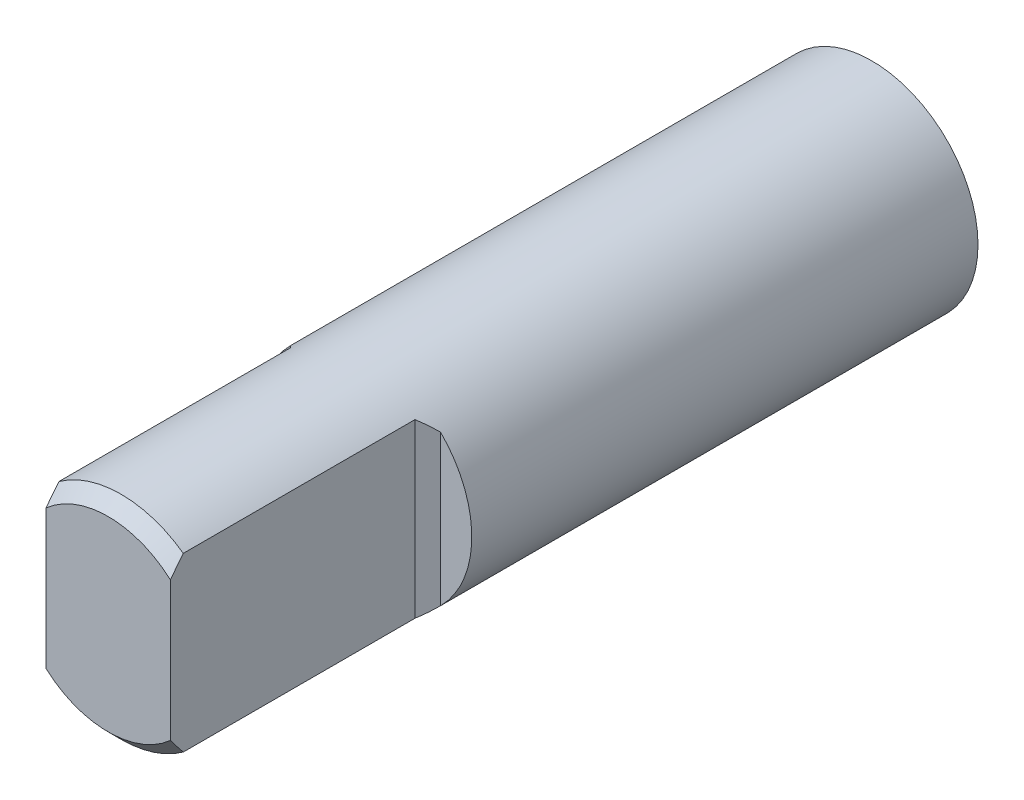
ISO-10303-21;
HEADER;
FILE_DESCRIPTION(('STEP AP214'),'2;1');
FILE_NAME('part.step','',(''),(''),'','','');
FILE_SCHEMA(('AUTOMOTIVE_DESIGN { 1 0 10303 214 1 1 1 1 }'));
ENDSEC;
DATA;
#1=APPLICATION_CONTEXT('core data for automotive mechanical design processes');
#2=APPLICATION_PROTOCOL_DEFINITION('international standard','automotive_design',2000,#1);
#3=PRODUCT_CONTEXT('',#1,'mechanical');
#4=PRODUCT('Part','Part','',(#3));
#5=PRODUCT_RELATED_PRODUCT_CATEGORY('part','',(#4));
#6=PRODUCT_DEFINITION_FORMATION('','',#4);
#7=PRODUCT_DEFINITION_CONTEXT('part definition',#1,'design');
#8=PRODUCT_DEFINITION('design','',#6,#7);
#9=PRODUCT_DEFINITION_SHAPE('','',#8);
#10=(LENGTH_UNIT() NAMED_UNIT(*) SI_UNIT(.MILLI.,.METRE.));
#11=(NAMED_UNIT(*) PLANE_ANGLE_UNIT() SI_UNIT($,.RADIAN.));
#12=(NAMED_UNIT(*) SI_UNIT($,.STERADIAN.) SOLID_ANGLE_UNIT());
#13=UNCERTAINTY_MEASURE_WITH_UNIT(LENGTH_MEASURE(1.E-05),#10,'distance_accuracy_value','');
#14=(GEOMETRIC_REPRESENTATION_CONTEXT(3) GLOBAL_UNCERTAINTY_ASSIGNED_CONTEXT((#13)) GLOBAL_UNIT_ASSIGNED_CONTEXT((#10,
#11,#12)) REPRESENTATION_CONTEXT('',''));
#15=CARTESIAN_POINT('',(0.,0.,0.));
#16=DIRECTION('',(0.,0.,1.));
#17=DIRECTION('',(1.,0.,0.));
#18=AXIS2_PLACEMENT_3D('',#15,#16,#17);
#19=CARTESIAN_POINT('',(0.,0.,17.8));
#20=DIRECTION('',(0.,0.,-1.));
#21=DIRECTION('',(-1.,0.,0.));
#22=AXIS2_PLACEMENT_3D('',#19,#20,#21);
#23=CYLINDRICAL_SURFACE('',#22,2.475);
#24=CARTESIAN_POINT('',(0.,0.,0.));
#25=DIRECTION('',(0.,0.,1.));
#26=DIRECTION('',(1.,0.,0.));
#27=AXIS2_PLACEMENT_3D('',#24,#25,#26);
#28=CIRCLE('',#27,2.475);
#29=CARTESIAN_POINT('',(2.475,0.,0.));
#30=VERTEX_POINT('',#29);
#31=EDGE_CURVE('E140',#30,#30,#28,.T.);
#32=ORIENTED_EDGE('',*,*,#31,.T.);
#33=EDGE_LOOP('',(#32));
#34=FACE_BOUND('',#33,.T.);
#35=DIRECTION('',(0.,0.,-1.));
#36=VECTOR('',#35,1.);
#37=CARTESIAN_POINT('',(1.45,-2.00577291835342,17.8));
#38=LINE('',#37,#36);
#39=CARTESIAN_POINT('',(1.45,-2.00577291835342,17.5));
#40=VERTEX_POINT('',#39);
#41=CARTESIAN_POINT('',(1.45,-2.00577291835342,12.1));
#42=VERTEX_POINT('',#41);
#43=EDGE_CURVE('E208',#40,#42,#38,.T.);
#44=ORIENTED_EDGE('',*,*,#43,.F.);
#45=CARTESIAN_POINT('',(0.,0.,17.5));
#46=DIRECTION('',(0.,0.,1.));
#47=DIRECTION('',(1.,0.,0.));
#48=AXIS2_PLACEMENT_3D('',#45,#46,#47);
#49=CIRCLE('',#48,2.475);
#50=CARTESIAN_POINT('',(-1.45,-2.00577291835342,17.5));
#51=VERTEX_POINT('',#50);
#52=EDGE_CURVE('E114',#40,#51,#49,.F.);
#53=ORIENTED_EDGE('',*,*,#52,.T.);
#54=DIRECTION('',(0.,0.,-1.));
#55=VECTOR('',#54,1.);
#56=CARTESIAN_POINT('',(-1.45,-2.00577291835342,17.8));
#57=LINE('',#56,#55);
#58=CARTESIAN_POINT('',(-1.45,-2.00577291835342,12.1));
#59=VERTEX_POINT('',#58);
#60=EDGE_CURVE('E219',#59,#51,#57,.F.);
#61=ORIENTED_EDGE('',*,*,#60,.F.);
#62=CARTESIAN_POINT('',(0.,0.,13.55));
#63=DIRECTION('',(-0.707106781186552,0.,0.707106781186543));
#64=DIRECTION('',(-0.707106781186543,0.,-0.707106781186552));
#65=AXIS2_PLACEMENT_3D('',#62,#63,#64);
#66=ELLIPSE('',#65,3.50017856687343,2.475);
#67=CARTESIAN_POINT('',(-1.75,-1.75017856231872,11.8));
#68=VERTEX_POINT('',#67);
#69=EDGE_CURVE('E224',#59,#68,#66,.F.);
#70=ORIENTED_EDGE('',*,*,#69,.T.);
#71=CARTESIAN_POINT('',(0.,0.,11.8));
#72=DIRECTION('',(0.,0.,1.));
#73=DIRECTION('',(1.,0.,0.));
#74=AXIS2_PLACEMENT_3D('',#71,#72,#73);
#75=CIRCLE('',#74,2.475);
#76=CARTESIAN_POINT('',(-1.75,1.75017856231872,11.8));
#77=VERTEX_POINT('',#76);
#78=EDGE_CURVE('E135',#77,#68,#75,.T.);
#79=ORIENTED_EDGE('',*,*,#78,.F.);
#80=CARTESIAN_POINT('',(0.,0.,13.55));
#81=DIRECTION('',(-0.707106781186552,0.,0.707106781186543));
#82=DIRECTION('',(-0.707106781186543,0.,-0.707106781186552));
#83=AXIS2_PLACEMENT_3D('',#80,#81,#82);
#84=ELLIPSE('',#83,3.50017856687343,2.475);
#85=CARTESIAN_POINT('',(-1.45,2.00577291835342,12.1));
#86=VERTEX_POINT('',#85);
#87=EDGE_CURVE('E228',#77,#86,#84,.F.);
#88=ORIENTED_EDGE('',*,*,#87,.T.);
#89=DIRECTION('',(0.,0.,-1.));
#90=VECTOR('',#89,1.);
#91=CARTESIAN_POINT('',(-1.45,2.00577291835342,17.8));
#92=LINE('',#91,#90);
#93=CARTESIAN_POINT('',(-1.45,2.00577291835342,17.5));
#94=VERTEX_POINT('',#93);
#95=EDGE_CURVE('E215',#94,#86,#92,.T.);
#96=ORIENTED_EDGE('',*,*,#95,.F.);
#97=CARTESIAN_POINT('',(0.,0.,17.5));
#98=DIRECTION('',(0.,0.,1.));
#99=DIRECTION('',(1.,0.,0.));
#100=AXIS2_PLACEMENT_3D('',#97,#98,#99);
#101=CIRCLE('',#100,2.475);
#102=CARTESIAN_POINT('',(1.45,2.00577291835342,17.5));
#103=VERTEX_POINT('',#102);
#104=EDGE_CURVE('E119',#94,#103,#101,.F.);
#105=ORIENTED_EDGE('',*,*,#104,.T.);
#106=DIRECTION('',(0.,0.,-1.));
#107=VECTOR('',#106,1.);
#108=CARTESIAN_POINT('',(1.45,2.00577291835342,17.8));
#109=LINE('',#108,#107);
#110=CARTESIAN_POINT('',(1.45,2.00577291835342,12.1));
#111=VERTEX_POINT('',#110);
#112=EDGE_CURVE('E213',#111,#103,#109,.F.);
#113=ORIENTED_EDGE('',*,*,#112,.F.);
#114=CARTESIAN_POINT('',(0.,0.,13.55));
#115=DIRECTION('',(0.707106781186552,0.,0.707106781186543));
#116=DIRECTION('',(0.707106781186543,0.,-0.707106781186552));
#117=AXIS2_PLACEMENT_3D('',#114,#115,#116);
#118=ELLIPSE('',#117,3.50017856687343,2.475);
#119=CARTESIAN_POINT('',(1.75,1.75017856231872,11.8));
#120=VERTEX_POINT('',#119);
#121=EDGE_CURVE('E53',#111,#120,#118,.F.);
#122=ORIENTED_EDGE('',*,*,#121,.T.);
#123=CARTESIAN_POINT('',(1.75,-1.75017856231872,11.8));
#124=VERTEX_POINT('',#123);
#125=EDGE_CURVE('E138',#124,#120,#75,.T.);
#126=ORIENTED_EDGE('',*,*,#125,.F.);
#127=CARTESIAN_POINT('',(0.,0.,13.55));
#128=DIRECTION('',(0.707106781186552,0.,0.707106781186543));
#129=DIRECTION('',(0.707106781186543,0.,-0.707106781186552));
#130=AXIS2_PLACEMENT_3D('',#127,#128,#129);
#131=ELLIPSE('',#130,3.50017856687343,2.475);
#132=EDGE_CURVE('E12',#124,#42,#131,.F.);
#133=ORIENTED_EDGE('',*,*,#132,.T.);
#134=EDGE_LOOP('',(#44,#53,#61,#70,#79,#88,#96,#105,#113,#122,#126,#133));
#135=FACE_BOUND('',#134,.T.);
#136=ADVANCED_FACE('F44',(#34,#135),#23,.T.);
#137=CARTESIAN_POINT('',(0.,0.,17.8));
#138=DIRECTION('',(0.,0.,1.));
#139=DIRECTION('',(1.,0.,0.));
#140=AXIS2_PLACEMENT_3D('',#137,#138,#139);
#141=PLANE('',#140);
#142=DIRECTION('',(0.,-1.,0.));
#143=VECTOR('',#142,1.);
#144=CARTESIAN_POINT('',(-1.45,0.,17.8));
#145=LINE('',#144,#143);
#146=CARTESIAN_POINT('',(-1.45,1.62114928368735,17.8));
#147=VERTEX_POINT('',#146);
#148=CARTESIAN_POINT('',(-1.45,-1.62114928368735,17.8));
#149=VERTEX_POINT('',#148);
#150=EDGE_CURVE('E130',#147,#149,#145,.T.);
#151=ORIENTED_EDGE('',*,*,#150,.T.);
#152=CARTESIAN_POINT('',(0.,0.,17.8));
#153=DIRECTION('',(0.,0.,1.));
#154=DIRECTION('',(1.,0.,0.));
#155=AXIS2_PLACEMENT_3D('',#152,#153,#154);
#156=CIRCLE('',#155,2.175);
#157=CARTESIAN_POINT('',(1.45,-1.62114928368735,17.8));
#158=VERTEX_POINT('',#157);
#159=EDGE_CURVE('E112',#149,#158,#156,.T.);
#160=ORIENTED_EDGE('',*,*,#159,.T.);
#161=DIRECTION('',(0.,1.,0.));
#162=VECTOR('',#161,1.);
#163=CARTESIAN_POINT('',(1.45,0.,17.8));
#164=LINE('',#163,#162);
#165=CARTESIAN_POINT('',(1.45,1.62114928368735,17.8));
#166=VERTEX_POINT('',#165);
#167=EDGE_CURVE('E127',#158,#166,#164,.T.);
#168=ORIENTED_EDGE('',*,*,#167,.T.);
#169=CARTESIAN_POINT('',(0.,0.,17.8));
#170=DIRECTION('',(0.,0.,1.));
#171=DIRECTION('',(1.,0.,0.));
#172=AXIS2_PLACEMENT_3D('',#169,#170,#171);
#173=CIRCLE('',#172,2.175);
#174=EDGE_CURVE('E131',#166,#147,#173,.T.);
#175=ORIENTED_EDGE('',*,*,#174,.T.);
#176=EDGE_LOOP('',(#151,#160,#168,#175));
#177=FACE_BOUND('',#176,.T.);
#178=ADVANCED_FACE('F125',(#177),#141,.T.);
#179=CARTESIAN_POINT('',(0.,0.,0.));
#180=DIRECTION('',(0.,0.,1.));
#181=DIRECTION('',(1.,0.,0.));
#182=AXIS2_PLACEMENT_3D('',#179,#180,#181);
#183=PLANE('',#182);
#184=ORIENTED_EDGE('',*,*,#31,.F.);
#185=EDGE_LOOP('',(#184));
#186=FACE_BOUND('',#185,.T.);
#187=ADVANCED_FACE('F187',(#186),#183,.F.);
#188=CARTESIAN_POINT('',(-1.45,3.5,11.8));
#189=DIRECTION('',(-1.,0.,0.));
#190=DIRECTION('',(0.,-1.,0.));
#191=AXIS2_PLACEMENT_3D('',#188,#189,#190);
#192=PLANE('',#191);
#193=ORIENTED_EDGE('',*,*,#95,.T.);
#194=DIRECTION('',(0.,-1.,0.));
#195=VECTOR('',#194,1.);
#196=CARTESIAN_POINT('',(-1.45,-2.00577291835342,12.1));
#197=LINE('',#196,#195);
#198=EDGE_CURVE('E222',#86,#59,#197,.T.);
#199=ORIENTED_EDGE('',*,*,#198,.T.);
#200=ORIENTED_EDGE('',*,*,#60,.T.);
#201=CARTESIAN_POINT('',(-1.45,-2.00577291835342,17.5));
#202=CARTESIAN_POINT('',(-1.45,-1.97418866262015,17.5255950039578));
#203=CARTESIAN_POINT('',(-1.45,-1.94250387974415,17.5510665479977));
#204=CARTESIAN_POINT('',(-1.45,-1.87891204532299,17.6017238808249));
#205=CARTESIAN_POINT('',(-1.45,-1.84700501669119,17.6269096983867));
#206=CARTESIAN_POINT('',(-1.45,-1.78294045222136,17.676962439913));
#207=CARTESIAN_POINT('',(-1.45,-1.75078291158453,17.7018293577444));
#208=CARTESIAN_POINT('',(-1.45,-1.68618492746668,17.7511996702028));
#209=CARTESIAN_POINT('',(-1.45,-1.65374445554357,17.7757030275977));
#210=CARTESIAN_POINT('',(-1.45,-1.62114928368749,17.8000000000002));
#211=B_SPLINE_CURVE_WITH_KNOTS('',3,(#201,#202,#203,#204,#205,#206,#207,#208,#209,#210),
.UNSPECIFIED.,.F.,.F.,(4,2,2,2,4),(0.,0.121959331011143,0.24390626893848,0.365855548657561,
0.487817232151487),.UNSPECIFIED.);
#212=EDGE_CURVE('E177',#51,#149,#211,.T.);
#213=ORIENTED_EDGE('',*,*,#212,.T.);
#214=ORIENTED_EDGE('',*,*,#150,.F.);
#215=CARTESIAN_POINT('',(-1.45,1.62114928368735,17.8));
#216=CARTESIAN_POINT('',(-1.45,1.65374445554351,17.7757030275977));
#217=CARTESIAN_POINT('',(-1.45,1.68618492746666,17.7511996702028));
#218=CARTESIAN_POINT('',(-1.45,1.75078291158454,17.7018293577444));
#219=CARTESIAN_POINT('',(-1.45,1.78294045222137,17.676962439913));
#220=CARTESIAN_POINT('',(-1.45,1.84700501669118,17.6269096983867));
#221=CARTESIAN_POINT('',(-1.45,1.87891204532298,17.6017238808249));
#222=CARTESIAN_POINT('',(-1.45,1.94250387974415,17.5510665479977));
#223=CARTESIAN_POINT('',(-1.45,1.97418866262017,17.5255950039579));
#224=CARTESIAN_POINT('',(-1.45,2.00577291835348,17.5000000000001));
#225=B_SPLINE_CURVE_WITH_KNOTS('',3,(#215,#216,#217,#218,#219,#220,#221,#222,#223,#224),
.UNSPECIFIED.,.F.,.F.,(4,2,2,2,4),(0.,0.121961683493927,0.243910963213009,0.365857901140345,
0.487817232151492),.UNSPECIFIED.);
#226=EDGE_CURVE('E170',#147,#94,#225,.T.);
#227=ORIENTED_EDGE('',*,*,#226,.T.);
#228=EDGE_LOOP('',(#193,#199,#200,#213,#214,#227));
#229=FACE_BOUND('',#228,.T.);
#230=ADVANCED_FACE('F183',(#229),#192,.T.);
#231=CARTESIAN_POINT('',(0.,0.,11.8));
#232=DIRECTION('',(0.,0.,1.));
#233=DIRECTION('',(1.,0.,0.));
#234=AXIS2_PLACEMENT_3D('',#231,#232,#233);
#235=PLANE('',#234);
#236=ORIENTED_EDGE('',*,*,#78,.T.);
#237=DIRECTION('',(0.,1.,0.));
#238=VECTOR('',#237,1.);
#239=CARTESIAN_POINT('',(-1.75,2.00577291835342,11.8));
#240=LINE('',#239,#238);
#241=EDGE_CURVE('E230',#68,#77,#240,.T.);
#242=ORIENTED_EDGE('',*,*,#241,.T.);
#243=EDGE_LOOP('',(#236,#242));
#244=FACE_BOUND('',#243,.T.);
#245=ADVANCED_FACE('F186',(#244),#235,.T.);
#246=ORIENTED_EDGE('',*,*,#125,.T.);
#247=DIRECTION('',(0.,-1.,0.));
#248=VECTOR('',#247,1.);
#249=CARTESIAN_POINT('',(1.75,-2.00577291835342,11.8));
#250=LINE('',#249,#248);
#251=EDGE_CURVE('E65',#120,#124,#250,.T.);
#252=ORIENTED_EDGE('',*,*,#251,.T.);
#253=EDGE_LOOP('',(#246,#252));
#254=FACE_BOUND('',#253,.T.);
#255=ADVANCED_FACE('F194',(#254),#235,.T.);
#256=CARTESIAN_POINT('',(1.45,3.5,11.8));
#257=DIRECTION('',(1.,0.,0.));
#258=DIRECTION('',(0.,0.,-1.));
#259=AXIS2_PLACEMENT_3D('',#256,#257,#258);
#260=PLANE('',#259);
#261=ORIENTED_EDGE('',*,*,#43,.T.);
#262=DIRECTION('',(0.,1.,0.));
#263=VECTOR('',#262,1.);
#264=CARTESIAN_POINT('',(1.45,2.00577291835342,12.1));
#265=LINE('',#264,#263);
#266=EDGE_CURVE('E231',#42,#111,#265,.T.);
#267=ORIENTED_EDGE('',*,*,#266,.T.);
#268=ORIENTED_EDGE('',*,*,#112,.T.);
#269=CARTESIAN_POINT('',(1.45,2.00577291835342,17.5));
#270=CARTESIAN_POINT('',(1.45,1.97418866262015,17.5255950039578));
#271=CARTESIAN_POINT('',(1.45,1.94250387974415,17.5510665479977));
#272=CARTESIAN_POINT('',(1.45,1.87891204532299,17.6017238808249));
#273=CARTESIAN_POINT('',(1.45,1.84700501669119,17.6269096983867));
#274=CARTESIAN_POINT('',(1.45,1.78294045222136,17.676962439913));
#275=CARTESIAN_POINT('',(1.45,1.75078291158453,17.7018293577444));
#276=CARTESIAN_POINT('',(1.45,1.68618492746668,17.7511996702028));
#277=CARTESIAN_POINT('',(1.45,1.65374445554357,17.7757030275977));
#278=CARTESIAN_POINT('',(1.45,1.62114928368749,17.8000000000002));
#279=B_SPLINE_CURVE_WITH_KNOTS('',3,(#269,#270,#271,#272,#273,#274,#275,#276,#277,#278),
.UNSPECIFIED.,.F.,.F.,(4,2,2,2,4),(0.,0.121959331011143,0.24390626893848,0.365855548657561,
0.487817232151487),.UNSPECIFIED.);
#280=EDGE_CURVE('E120',#103,#166,#279,.T.);
#281=ORIENTED_EDGE('',*,*,#280,.T.);
#282=ORIENTED_EDGE('',*,*,#167,.F.);
#283=CARTESIAN_POINT('',(1.45,-1.62114928368735,17.8));
#284=CARTESIAN_POINT('',(1.45,-1.65374445554351,17.7757030275977));
#285=CARTESIAN_POINT('',(1.45,-1.68618492746666,17.7511996702028));
#286=CARTESIAN_POINT('',(1.45,-1.75078291158454,17.7018293577444));
#287=CARTESIAN_POINT('',(1.45,-1.78294045222137,17.676962439913));
#288=CARTESIAN_POINT('',(1.45,-1.84700501669118,17.6269096983867));
#289=CARTESIAN_POINT('',(1.45,-1.87891204532298,17.6017238808249));
#290=CARTESIAN_POINT('',(1.45,-1.94250387974415,17.5510665479977));
#291=CARTESIAN_POINT('',(1.45,-1.97418866262017,17.5255950039579));
#292=CARTESIAN_POINT('',(1.45,-2.00577291835348,17.5000000000001));
#293=B_SPLINE_CURVE_WITH_KNOTS('',3,(#283,#284,#285,#286,#287,#288,#289,#290,#291,#292),
.UNSPECIFIED.,.F.,.F.,(4,2,2,2,4),(0.,0.121961683493927,0.243910963213009,0.365857901140345,
0.487817232151492),.UNSPECIFIED.);
#294=EDGE_CURVE('E108',#158,#40,#293,.T.);
#295=ORIENTED_EDGE('',*,*,#294,.T.);
#296=EDGE_LOOP('',(#261,#267,#268,#281,#282,#295));
#297=FACE_BOUND('',#296,.T.);
#298=ADVANCED_FACE('F133',(#297),#260,.T.);
#299=CARTESIAN_POINT('',(0.,0.,17.8));
#300=DIRECTION('',(0.,0.,-1.));
#301=DIRECTION('',(-1.,0.,0.));
#302=AXIS2_PLACEMENT_3D('',#299,#300,#301);
#303=CONICAL_SURFACE('',#302,2.175,0.785398163397452);
#304=ORIENTED_EDGE('',*,*,#212,.F.);
#305=ORIENTED_EDGE('',*,*,#52,.F.);
#306=ORIENTED_EDGE('',*,*,#294,.F.);
#307=ORIENTED_EDGE('',*,*,#159,.F.);
#308=EDGE_LOOP('',(#304,#305,#306,#307));
#309=FACE_BOUND('',#308,.T.);
#310=ADVANCED_FACE('F111',(#309),#303,.T.);
#311=CARTESIAN_POINT('',(0.,0.,17.8));
#312=DIRECTION('',(0.,0.,-1.));
#313=DIRECTION('',(-1.,0.,0.));
#314=AXIS2_PLACEMENT_3D('',#311,#312,#313);
#315=CONICAL_SURFACE('',#314,2.175,0.785398163397452);
#316=ORIENTED_EDGE('',*,*,#280,.F.);
#317=ORIENTED_EDGE('',*,*,#104,.F.);
#318=ORIENTED_EDGE('',*,*,#226,.F.);
#319=ORIENTED_EDGE('',*,*,#174,.F.);
#320=EDGE_LOOP('',(#316,#317,#318,#319));
#321=FACE_BOUND('',#320,.T.);
#322=ADVANCED_FACE('F160',(#321),#315,.T.);
#323=CARTESIAN_POINT('',(-1.45,3.5,12.1));
#324=DIRECTION('',(-0.707106781186552,0.,0.707106781186543));
#325=DIRECTION('',(0.,1.,0.));
#326=AXIS2_PLACEMENT_3D('',#323,#324,#325);
#327=PLANE('',#326);
#328=ORIENTED_EDGE('',*,*,#87,.F.);
#329=ORIENTED_EDGE('',*,*,#241,.F.);
#330=ORIENTED_EDGE('',*,*,#69,.F.);
#331=ORIENTED_EDGE('',*,*,#198,.F.);
#332=EDGE_LOOP('',(#328,#329,#330,#331));
#333=FACE_BOUND('',#332,.T.);
#334=ADVANCED_FACE('F163',(#333),#327,.T.);
#335=CARTESIAN_POINT('',(1.45,3.5,12.1));
#336=DIRECTION('',(0.707106781186552,0.,0.707106781186543));
#337=DIRECTION('',(0.,-1.,0.));
#338=AXIS2_PLACEMENT_3D('',#335,#336,#337);
#339=PLANE('',#338);
#340=ORIENTED_EDGE('',*,*,#132,.F.);
#341=ORIENTED_EDGE('',*,*,#251,.F.);
#342=ORIENTED_EDGE('',*,*,#121,.F.);
#343=ORIENTED_EDGE('',*,*,#266,.F.);
#344=EDGE_LOOP('',(#340,#341,#342,#343));
#345=FACE_BOUND('',#344,.T.);
#346=ADVANCED_FACE('F47',(#345),#339,.T.);
#347=CLOSED_SHELL('',(#136,#178,#187,#230,#245,#255,#298,#310,#322,#334,#346));
#348=MANIFOLD_SOLID_BREP('B2',#347);
#349=ADVANCED_BREP_SHAPE_REPRESENTATION('',(#18,#348),#14);
#350=SHAPE_DEFINITION_REPRESENTATION(#9,#349);
ENDSEC;
END-ISO-10303-21;
